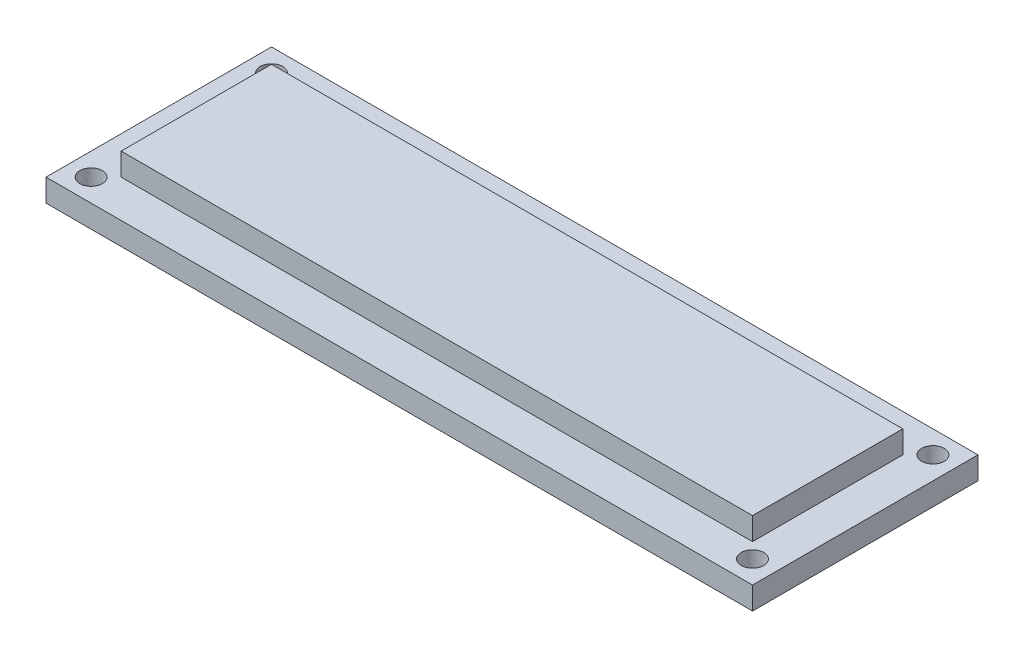
ISO-10303-21;
HEADER;
FILE_DESCRIPTION(('STEP AP214'),'2;1');
FILE_NAME('part.step','',(''),(''),'','','');
FILE_SCHEMA(('AUTOMOTIVE_DESIGN { 1 0 10303 214 1 1 1 1 }'));
ENDSEC;
DATA;
#1=APPLICATION_CONTEXT('core data for automotive mechanical design processes');
#2=APPLICATION_PROTOCOL_DEFINITION('international standard','automotive_design',2000,#1);
#3=PRODUCT_CONTEXT('',#1,'mechanical');
#4=PRODUCT('Part','Part','',(#3));
#5=PRODUCT_RELATED_PRODUCT_CATEGORY('part','',(#4));
#6=PRODUCT_DEFINITION_FORMATION('','',#4);
#7=PRODUCT_DEFINITION_CONTEXT('part definition',#1,'design');
#8=PRODUCT_DEFINITION('design','',#6,#7);
#9=PRODUCT_DEFINITION_SHAPE('','',#8);
#10=(LENGTH_UNIT() NAMED_UNIT(*) SI_UNIT(.MILLI.,.METRE.));
#11=(NAMED_UNIT(*) PLANE_ANGLE_UNIT() SI_UNIT($,.RADIAN.));
#12=(NAMED_UNIT(*) SI_UNIT($,.STERADIAN.) SOLID_ANGLE_UNIT());
#13=UNCERTAINTY_MEASURE_WITH_UNIT(LENGTH_MEASURE(1.E-05),#10,'distance_accuracy_value','');
#14=(GEOMETRIC_REPRESENTATION_CONTEXT(3) GLOBAL_UNCERTAINTY_ASSIGNED_CONTEXT((#13)) GLOBAL_UNIT_ASSIGNED_CONTEXT((#10,
#11,#12)) REPRESENTATION_CONTEXT('',''));
#15=CARTESIAN_POINT('',(0.,0.,0.));
#16=DIRECTION('',(0.,0.,1.));
#17=DIRECTION('',(1.,0.,0.));
#18=AXIS2_PLACEMENT_3D('',#15,#16,#17);
#19=CARTESIAN_POINT('',(42.,3.,10.));
#20=DIRECTION('',(-1.,0.,0.));
#21=DIRECTION('',(0.,0.,1.));
#22=AXIS2_PLACEMENT_3D('',#19,#20,#21);
#23=PLANE('',#22);
#24=DIRECTION('',(0.,0.,-1.));
#25=VECTOR('',#24,1.);
#26=CARTESIAN_POINT('',(42.,0.,10.));
#27=LINE('',#26,#25);
#28=CARTESIAN_POINT('',(42.,0.,10.));
#29=VERTEX_POINT('',#28);
#30=CARTESIAN_POINT('',(42.,0.,-10.));
#31=VERTEX_POINT('',#30);
#32=EDGE_CURVE('E117',#29,#31,#27,.T.);
#33=ORIENTED_EDGE('',*,*,#32,.T.);
#34=DIRECTION('',(0.,-1.,0.));
#35=VECTOR('',#34,1.);
#36=CARTESIAN_POINT('',(42.,3.,-10.));
#37=LINE('',#36,#35);
#38=CARTESIAN_POINT('',(42.,3.,-10.));
#39=VERTEX_POINT('',#38);
#40=EDGE_CURVE('E11',#39,#31,#37,.T.);
#41=ORIENTED_EDGE('',*,*,#40,.F.);
#42=DIRECTION('',(0.,0.,-1.));
#43=VECTOR('',#42,1.);
#44=CARTESIAN_POINT('',(42.,3.,10.));
#45=LINE('',#44,#43);
#46=CARTESIAN_POINT('',(42.,3.,10.));
#47=VERTEX_POINT('',#46);
#48=EDGE_CURVE('E126',#47,#39,#45,.T.);
#49=ORIENTED_EDGE('',*,*,#48,.F.);
#50=DIRECTION('',(0.,-1.,0.));
#51=VECTOR('',#50,1.);
#52=CARTESIAN_POINT('',(42.,3.,10.));
#53=LINE('',#52,#51);
#54=EDGE_CURVE('E133',#47,#29,#53,.T.);
#55=ORIENTED_EDGE('',*,*,#54,.T.);
#56=EDGE_LOOP('',(#33,#41,#49,#55));
#57=FACE_BOUND('',#56,.T.);
#58=ADVANCED_FACE('F31',(#57),#23,.F.);
#59=CARTESIAN_POINT('',(-42.,3.,-10.));
#60=DIRECTION('',(0.,0.,1.));
#61=DIRECTION('',(1.,0.,0.));
#62=AXIS2_PLACEMENT_3D('',#59,#60,#61);
#63=PLANE('',#62);
#64=DIRECTION('',(-1.,0.,0.));
#65=VECTOR('',#64,1.);
#66=CARTESIAN_POINT('',(-42.,0.,-10.));
#67=LINE('',#66,#65);
#68=CARTESIAN_POINT('',(-42.,0.,-9.99999999999999));
#69=VERTEX_POINT('',#68);
#70=EDGE_CURVE('E120',#31,#69,#67,.T.);
#71=ORIENTED_EDGE('',*,*,#70,.T.);
#72=DIRECTION('',(0.,-1.,0.));
#73=VECTOR('',#72,1.);
#74=CARTESIAN_POINT('',(-42.,3.,-10.));
#75=LINE('',#74,#73);
#76=CARTESIAN_POINT('',(-42.,3.,-10.));
#77=VERTEX_POINT('',#76);
#78=EDGE_CURVE('E39',#77,#69,#75,.T.);
#79=ORIENTED_EDGE('',*,*,#78,.F.);
#80=DIRECTION('',(-1.,0.,0.));
#81=VECTOR('',#80,1.);
#82=CARTESIAN_POINT('',(-42.,3.,-10.));
#83=LINE('',#82,#81);
#84=EDGE_CURVE('E128',#39,#77,#83,.T.);
#85=ORIENTED_EDGE('',*,*,#84,.F.);
#86=ORIENTED_EDGE('',*,*,#40,.T.);
#87=EDGE_LOOP('',(#71,#79,#85,#86));
#88=FACE_BOUND('',#87,.T.);
#89=ADVANCED_FACE('F153',(#88),#63,.F.);
#90=CARTESIAN_POINT('',(-42.,3.,10.));
#91=DIRECTION('',(1.,0.,0.));
#92=DIRECTION('',(0.,0.,-1.));
#93=AXIS2_PLACEMENT_3D('',#90,#91,#92);
#94=PLANE('',#93);
#95=DIRECTION('',(0.,0.,1.));
#96=VECTOR('',#95,1.);
#97=CARTESIAN_POINT('',(-42.,0.,10.));
#98=LINE('',#97,#96);
#99=CARTESIAN_POINT('',(-42.,0.,10.));
#100=VERTEX_POINT('',#99);
#101=EDGE_CURVE('E137',#69,#100,#98,.T.);
#102=ORIENTED_EDGE('',*,*,#101,.T.);
#103=DIRECTION('',(0.,-1.,0.));
#104=VECTOR('',#103,1.);
#105=CARTESIAN_POINT('',(-42.,3.,10.));
#106=LINE('',#105,#104);
#107=CARTESIAN_POINT('',(-42.,3.,10.));
#108=VERTEX_POINT('',#107);
#109=EDGE_CURVE('E144',#108,#100,#106,.T.);
#110=ORIENTED_EDGE('',*,*,#109,.F.);
#111=DIRECTION('',(0.,0.,1.));
#112=VECTOR('',#111,1.);
#113=CARTESIAN_POINT('',(-42.,3.,10.));
#114=LINE('',#113,#112);
#115=EDGE_CURVE('E131',#77,#108,#114,.T.);
#116=ORIENTED_EDGE('',*,*,#115,.F.);
#117=ORIENTED_EDGE('',*,*,#78,.T.);
#118=EDGE_LOOP('',(#102,#110,#116,#117));
#119=FACE_BOUND('',#118,.T.);
#120=ADVANCED_FACE('F150',(#119),#94,.F.);
#121=CARTESIAN_POINT('',(-42.,3.,10.));
#122=DIRECTION('',(0.,0.,-1.));
#123=DIRECTION('',(-1.,0.,0.));
#124=AXIS2_PLACEMENT_3D('',#121,#122,#123);
#125=PLANE('',#124);
#126=DIRECTION('',(1.,0.,0.));
#127=VECTOR('',#126,1.);
#128=CARTESIAN_POINT('',(-42.,0.,10.));
#129=LINE('',#128,#127);
#130=EDGE_CURVE('E129',#100,#29,#129,.T.);
#131=ORIENTED_EDGE('',*,*,#130,.T.);
#132=ORIENTED_EDGE('',*,*,#54,.F.);
#133=DIRECTION('',(1.,0.,0.));
#134=VECTOR('',#133,1.);
#135=CARTESIAN_POINT('',(-42.,3.,10.));
#136=LINE('',#135,#134);
#137=EDGE_CURVE('E46',#108,#47,#136,.T.);
#138=ORIENTED_EDGE('',*,*,#137,.F.);
#139=ORIENTED_EDGE('',*,*,#109,.T.);
#140=EDGE_LOOP('',(#131,#132,#138,#139));
#141=FACE_BOUND('',#140,.T.);
#142=ADVANCED_FACE('F159',(#141),#125,.F.);
#143=CARTESIAN_POINT('',(42.,3.,-10.));
#144=DIRECTION('',(0.,-1.,0.));
#145=DIRECTION('',(0.,0.,-1.));
#146=AXIS2_PLACEMENT_3D('',#143,#144,#145);
#147=PLANE('',#146);
#148=ORIENTED_EDGE('',*,*,#48,.T.);
#149=ORIENTED_EDGE('',*,*,#84,.T.);
#150=ORIENTED_EDGE('',*,*,#115,.T.);
#151=ORIENTED_EDGE('',*,*,#137,.T.);
#152=EDGE_LOOP('',(#148,#149,#150,#151));
#153=FACE_BOUND('',#152,.T.);
#154=ADVANCED_FACE('F162',(#153),#147,.F.);
#155=CARTESIAN_POINT('',(47.,0.,-15.));
#156=DIRECTION('',(0.,-1.,0.));
#157=DIRECTION('',(0.,0.,-1.));
#158=AXIS2_PLACEMENT_3D('',#155,#156,#157);
#159=PLANE('',#158);
#160=CARTESIAN_POINT('',(44.,0.,-12.));
#161=DIRECTION('',(0.,-1.,0.));
#162=DIRECTION('',(0.,0.,-1.));
#163=AXIS2_PLACEMENT_3D('',#160,#161,#162);
#164=CIRCLE('',#163,1.5);
#165=CARTESIAN_POINT('',(44.,0.,-13.5));
#166=VERTEX_POINT('',#165);
#167=EDGE_CURVE('E288',#166,#166,#164,.T.);
#168=ORIENTED_EDGE('',*,*,#167,.T.);
#169=EDGE_LOOP('',(#168));
#170=FACE_BOUND('',#169,.T.);
#171=CARTESIAN_POINT('',(-44.,0.,-12.));
#172=DIRECTION('',(0.,-1.,0.));
#173=DIRECTION('',(0.,0.,-1.));
#174=AXIS2_PLACEMENT_3D('',#171,#172,#173);
#175=CIRCLE('',#174,1.5);
#176=CARTESIAN_POINT('',(-44.,0.,-13.5));
#177=VERTEX_POINT('',#176);
#178=EDGE_CURVE('E296',#177,#177,#175,.T.);
#179=ORIENTED_EDGE('',*,*,#178,.T.);
#180=EDGE_LOOP('',(#179));
#181=FACE_BOUND('',#180,.T.);
#182=DIRECTION('',(1.,0.,0.));
#183=VECTOR('',#182,1.);
#184=CARTESIAN_POINT('',(-47.,0.,-15.));
#185=LINE('',#184,#183);
#186=CARTESIAN_POINT('',(-47.,0.,-15.));
#187=VERTEX_POINT('',#186);
#188=CARTESIAN_POINT('',(47.,0.,-15.));
#189=VERTEX_POINT('',#188);
#190=EDGE_CURVE('E116',#187,#189,#185,.T.);
#191=ORIENTED_EDGE('',*,*,#190,.F.);
#192=DIRECTION('',(0.,0.,-1.));
#193=VECTOR('',#192,1.);
#194=CARTESIAN_POINT('',(-47.,0.,15.));
#195=LINE('',#194,#193);
#196=CARTESIAN_POINT('',(-47.,0.,15.));
#197=VERTEX_POINT('',#196);
#198=EDGE_CURVE('E112',#197,#187,#195,.T.);
#199=ORIENTED_EDGE('',*,*,#198,.F.);
#200=DIRECTION('',(-1.,0.,0.));
#201=VECTOR('',#200,1.);
#202=CARTESIAN_POINT('',(47.,0.,15.));
#203=LINE('',#202,#201);
#204=CARTESIAN_POINT('',(47.,0.,15.));
#205=VERTEX_POINT('',#204);
#206=EDGE_CURVE('E316',#205,#197,#203,.T.);
#207=ORIENTED_EDGE('',*,*,#206,.F.);
#208=DIRECTION('',(0.,0.,1.));
#209=VECTOR('',#208,1.);
#210=CARTESIAN_POINT('',(47.,0.,-15.));
#211=LINE('',#210,#209);
#212=EDGE_CURVE('E314',#189,#205,#211,.T.);
#213=ORIENTED_EDGE('',*,*,#212,.F.);
#214=EDGE_LOOP('',(#191,#199,#207,#213));
#215=FACE_BOUND('',#214,.T.);
#216=CARTESIAN_POINT('',(-44.,0.,12.));
#217=DIRECTION('',(0.,-1.,0.));
#218=DIRECTION('',(0.,0.,-1.));
#219=AXIS2_PLACEMENT_3D('',#216,#217,#218);
#220=CIRCLE('',#219,1.5);
#221=CARTESIAN_POINT('',(-44.,0.,10.5));
#222=VERTEX_POINT('',#221);
#223=EDGE_CURVE('E302',#222,#222,#220,.T.);
#224=ORIENTED_EDGE('',*,*,#223,.T.);
#225=EDGE_LOOP('',(#224));
#226=FACE_BOUND('',#225,.T.);
#227=CARTESIAN_POINT('',(44.,0.,12.));
#228=DIRECTION('',(0.,-1.,0.));
#229=DIRECTION('',(0.,0.,-1.));
#230=AXIS2_PLACEMENT_3D('',#227,#228,#229);
#231=CIRCLE('',#230,1.5);
#232=CARTESIAN_POINT('',(44.,0.,10.5));
#233=VERTEX_POINT('',#232);
#234=EDGE_CURVE('E290',#233,#233,#231,.T.);
#235=ORIENTED_EDGE('',*,*,#234,.T.);
#236=EDGE_LOOP('',(#235));
#237=FACE_BOUND('',#236,.T.);
#238=ORIENTED_EDGE('',*,*,#70,.F.);
#239=ORIENTED_EDGE('',*,*,#32,.F.);
#240=ORIENTED_EDGE('',*,*,#130,.F.);
#241=ORIENTED_EDGE('',*,*,#101,.F.);
#242=EDGE_LOOP('',(#238,#239,#240,#241));
#243=FACE_BOUND('',#242,.T.);
#244=ADVANCED_FACE('F157',(#170,#181,#215,#226,#237,#243),#159,.F.);
#245=CARTESIAN_POINT('',(47.,-3.,-15.));
#246=DIRECTION('',(0.,-1.,0.));
#247=DIRECTION('',(0.,0.,-1.));
#248=AXIS2_PLACEMENT_3D('',#245,#246,#247);
#249=PLANE('',#248);
#250=CARTESIAN_POINT('',(44.,-3.,12.));
#251=DIRECTION('',(0.,-1.,0.));
#252=DIRECTION('',(0.,0.,-1.));
#253=AXIS2_PLACEMENT_3D('',#250,#251,#252);
#254=CIRCLE('',#253,1.5);
#255=CARTESIAN_POINT('',(44.,-3.,10.5));
#256=VERTEX_POINT('',#255);
#257=EDGE_CURVE('E293',#256,#256,#254,.T.);
#258=ORIENTED_EDGE('',*,*,#257,.F.);
#259=EDGE_LOOP('',(#258));
#260=FACE_BOUND('',#259,.T.);
#261=CARTESIAN_POINT('',(-44.,-3.,12.));
#262=DIRECTION('',(0.,-1.,0.));
#263=DIRECTION('',(0.,0.,-1.));
#264=AXIS2_PLACEMENT_3D('',#261,#262,#263);
#265=CIRCLE('',#264,1.5);
#266=CARTESIAN_POINT('',(-44.,-3.,10.5));
#267=VERTEX_POINT('',#266);
#268=EDGE_CURVE('E305',#267,#267,#265,.T.);
#269=ORIENTED_EDGE('',*,*,#268,.F.);
#270=EDGE_LOOP('',(#269));
#271=FACE_BOUND('',#270,.T.);
#272=DIRECTION('',(1.,0.,0.));
#273=VECTOR('',#272,1.);
#274=CARTESIAN_POINT('',(-47.,-3.,-15.));
#275=LINE('',#274,#273);
#276=CARTESIAN_POINT('',(-47.,-3.,-15.));
#277=VERTEX_POINT('',#276);
#278=CARTESIAN_POINT('',(47.,-3.,-15.));
#279=VERTEX_POINT('',#278);
#280=EDGE_CURVE('E102',#277,#279,#275,.T.);
#281=ORIENTED_EDGE('',*,*,#280,.T.);
#282=DIRECTION('',(0.,0.,1.));
#283=VECTOR('',#282,1.);
#284=CARTESIAN_POINT('',(47.,-3.,-15.));
#285=LINE('',#284,#283);
#286=CARTESIAN_POINT('',(47.,-3.,15.));
#287=VERTEX_POINT('',#286);
#288=EDGE_CURVE('E91',#279,#287,#285,.T.);
#289=ORIENTED_EDGE('',*,*,#288,.T.);
#290=DIRECTION('',(-1.,0.,0.));
#291=VECTOR('',#290,1.);
#292=CARTESIAN_POINT('',(47.,-3.,15.));
#293=LINE('',#292,#291);
#294=CARTESIAN_POINT('',(-47.,-3.,15.));
#295=VERTEX_POINT('',#294);
#296=EDGE_CURVE('E101',#287,#295,#293,.T.);
#297=ORIENTED_EDGE('',*,*,#296,.T.);
#298=DIRECTION('',(0.,0.,-1.));
#299=VECTOR('',#298,1.);
#300=CARTESIAN_POINT('',(-47.,-3.,15.));
#301=LINE('',#300,#299);
#302=EDGE_CURVE('E108',#295,#277,#301,.T.);
#303=ORIENTED_EDGE('',*,*,#302,.T.);
#304=EDGE_LOOP('',(#281,#289,#297,#303));
#305=FACE_BOUND('',#304,.T.);
#306=CARTESIAN_POINT('',(-44.,-3.,-12.));
#307=DIRECTION('',(0.,-1.,0.));
#308=DIRECTION('',(0.,0.,-1.));
#309=AXIS2_PLACEMENT_3D('',#306,#307,#308);
#310=CIRCLE('',#309,1.5);
#311=CARTESIAN_POINT('',(-44.,-3.,-13.5));
#312=VERTEX_POINT('',#311);
#313=EDGE_CURVE('E299',#312,#312,#310,.T.);
#314=ORIENTED_EDGE('',*,*,#313,.F.);
#315=EDGE_LOOP('',(#314));
#316=FACE_BOUND('',#315,.T.);
#317=CARTESIAN_POINT('',(44.,-3.,-12.));
#318=DIRECTION('',(0.,-1.,0.));
#319=DIRECTION('',(0.,0.,-1.));
#320=AXIS2_PLACEMENT_3D('',#317,#318,#319);
#321=CIRCLE('',#320,1.5);
#322=CARTESIAN_POINT('',(44.,-3.,-13.5));
#323=VERTEX_POINT('',#322);
#324=EDGE_CURVE('E285',#323,#323,#321,.T.);
#325=ORIENTED_EDGE('',*,*,#324,.F.);
#326=EDGE_LOOP('',(#325));
#327=FACE_BOUND('',#326,.T.);
#328=ADVANCED_FACE('F105',(#260,#271,#305,#316,#327),#249,.T.);
#329=CARTESIAN_POINT('',(-47.,-3.,-15.));
#330=DIRECTION('',(0.,0.,1.));
#331=DIRECTION('',(1.,0.,0.));
#332=AXIS2_PLACEMENT_3D('',#329,#330,#331);
#333=PLANE('',#332);
#334=ORIENTED_EDGE('',*,*,#190,.T.);
#335=DIRECTION('',(0.,1.,0.));
#336=VECTOR('',#335,1.);
#337=CARTESIAN_POINT('',(47.,-3.,-15.));
#338=LINE('',#337,#336);
#339=EDGE_CURVE('E95',#279,#189,#338,.T.);
#340=ORIENTED_EDGE('',*,*,#339,.F.);
#341=ORIENTED_EDGE('',*,*,#280,.F.);
#342=DIRECTION('',(0.,1.,0.));
#343=VECTOR('',#342,1.);
#344=CARTESIAN_POINT('',(-47.,-3.,-15.));
#345=LINE('',#344,#343);
#346=EDGE_CURVE('E312',#277,#187,#345,.T.);
#347=ORIENTED_EDGE('',*,*,#346,.T.);
#348=EDGE_LOOP('',(#334,#340,#341,#347));
#349=FACE_BOUND('',#348,.T.);
#350=ADVANCED_FACE('F114',(#349),#333,.F.);
#351=CARTESIAN_POINT('',(47.,-3.,-15.));
#352=DIRECTION('',(-1.,0.,0.));
#353=DIRECTION('',(0.,0.,1.));
#354=AXIS2_PLACEMENT_3D('',#351,#352,#353);
#355=PLANE('',#354);
#356=ORIENTED_EDGE('',*,*,#212,.T.);
#357=DIRECTION('',(0.,1.,0.));
#358=VECTOR('',#357,1.);
#359=CARTESIAN_POINT('',(47.,-3.,15.));
#360=LINE('',#359,#358);
#361=EDGE_CURVE('E98',#287,#205,#360,.T.);
#362=ORIENTED_EDGE('',*,*,#361,.F.);
#363=ORIENTED_EDGE('',*,*,#288,.F.);
#364=ORIENTED_EDGE('',*,*,#339,.T.);
#365=EDGE_LOOP('',(#356,#362,#363,#364));
#366=FACE_BOUND('',#365,.T.);
#367=ADVANCED_FACE('F93',(#366),#355,.F.);
#368=CARTESIAN_POINT('',(47.,-3.,15.));
#369=DIRECTION('',(0.,0.,-1.));
#370=DIRECTION('',(-1.,0.,0.));
#371=AXIS2_PLACEMENT_3D('',#368,#369,#370);
#372=PLANE('',#371);
#373=ORIENTED_EDGE('',*,*,#206,.T.);
#374=DIRECTION('',(0.,1.,0.));
#375=VECTOR('',#374,1.);
#376=CARTESIAN_POINT('',(-47.,-3.,15.));
#377=LINE('',#376,#375);
#378=EDGE_CURVE('E122',#295,#197,#377,.T.);
#379=ORIENTED_EDGE('',*,*,#378,.F.);
#380=ORIENTED_EDGE('',*,*,#296,.F.);
#381=ORIENTED_EDGE('',*,*,#361,.T.);
#382=EDGE_LOOP('',(#373,#379,#380,#381));
#383=FACE_BOUND('',#382,.T.);
#384=ADVANCED_FACE('F219',(#383),#372,.F.);
#385=CARTESIAN_POINT('',(-47.,-3.,15.));
#386=DIRECTION('',(1.,0.,0.));
#387=DIRECTION('',(0.,0.,-1.));
#388=AXIS2_PLACEMENT_3D('',#385,#386,#387);
#389=PLANE('',#388);
#390=ORIENTED_EDGE('',*,*,#198,.T.);
#391=ORIENTED_EDGE('',*,*,#346,.F.);
#392=ORIENTED_EDGE('',*,*,#302,.F.);
#393=ORIENTED_EDGE('',*,*,#378,.T.);
#394=EDGE_LOOP('',(#390,#391,#392,#393));
#395=FACE_BOUND('',#394,.T.);
#396=ADVANCED_FACE('F228',(#395),#389,.F.);
#397=CARTESIAN_POINT('',(-44.,-3.,12.));
#398=DIRECTION('',(0.,1.,0.));
#399=DIRECTION('',(0.,0.,1.));
#400=AXIS2_PLACEMENT_3D('',#397,#398,#399);
#401=CYLINDRICAL_SURFACE('',#400,1.5);
#402=ORIENTED_EDGE('',*,*,#268,.T.);
#403=EDGE_LOOP('',(#402));
#404=FACE_BOUND('',#403,.T.);
#405=ORIENTED_EDGE('',*,*,#223,.F.);
#406=EDGE_LOOP('',(#405));
#407=FACE_BOUND('',#406,.T.);
#408=ADVANCED_FACE('F238',(#404,#407),#401,.F.);
#409=CARTESIAN_POINT('',(-44.,-3.,-12.));
#410=DIRECTION('',(0.,1.,0.));
#411=DIRECTION('',(0.,0.,1.));
#412=AXIS2_PLACEMENT_3D('',#409,#410,#411);
#413=CYLINDRICAL_SURFACE('',#412,1.5);
#414=ORIENTED_EDGE('',*,*,#313,.T.);
#415=EDGE_LOOP('',(#414));
#416=FACE_BOUND('',#415,.T.);
#417=ORIENTED_EDGE('',*,*,#178,.F.);
#418=EDGE_LOOP('',(#417));
#419=FACE_BOUND('',#418,.T.);
#420=ADVANCED_FACE('F248',(#416,#419),#413,.F.);
#421=CARTESIAN_POINT('',(44.,-3.,12.));
#422=DIRECTION('',(0.,1.,0.));
#423=DIRECTION('',(0.,0.,1.));
#424=AXIS2_PLACEMENT_3D('',#421,#422,#423);
#425=CYLINDRICAL_SURFACE('',#424,1.5);
#426=ORIENTED_EDGE('',*,*,#257,.T.);
#427=EDGE_LOOP('',(#426));
#428=FACE_BOUND('',#427,.T.);
#429=ORIENTED_EDGE('',*,*,#234,.F.);
#430=EDGE_LOOP('',(#429));
#431=FACE_BOUND('',#430,.T.);
#432=ADVANCED_FACE('F258',(#428,#431),#425,.F.);
#433=CARTESIAN_POINT('',(44.,-3.,-12.));
#434=DIRECTION('',(0.,1.,0.));
#435=DIRECTION('',(0.,0.,1.));
#436=AXIS2_PLACEMENT_3D('',#433,#434,#435);
#437=CYLINDRICAL_SURFACE('',#436,1.5);
#438=ORIENTED_EDGE('',*,*,#324,.T.);
#439=EDGE_LOOP('',(#438));
#440=FACE_BOUND('',#439,.T.);
#441=ORIENTED_EDGE('',*,*,#167,.F.);
#442=EDGE_LOOP('',(#441));
#443=FACE_BOUND('',#442,.T.);
#444=ADVANCED_FACE('F268',(#440,#443),#437,.F.);
#445=CLOSED_SHELL('',(#58,#89,#120,#142,#154,#244,#328,#350,#367,#384,#396,#408,#420,#432,#444));
#446=MANIFOLD_SOLID_BREP('B2',#445);
#447=ADVANCED_BREP_SHAPE_REPRESENTATION('',(#18,#446),#14);
#448=SHAPE_DEFINITION_REPRESENTATION(#9,#447);
ENDSEC;
END-ISO-10303-21;
